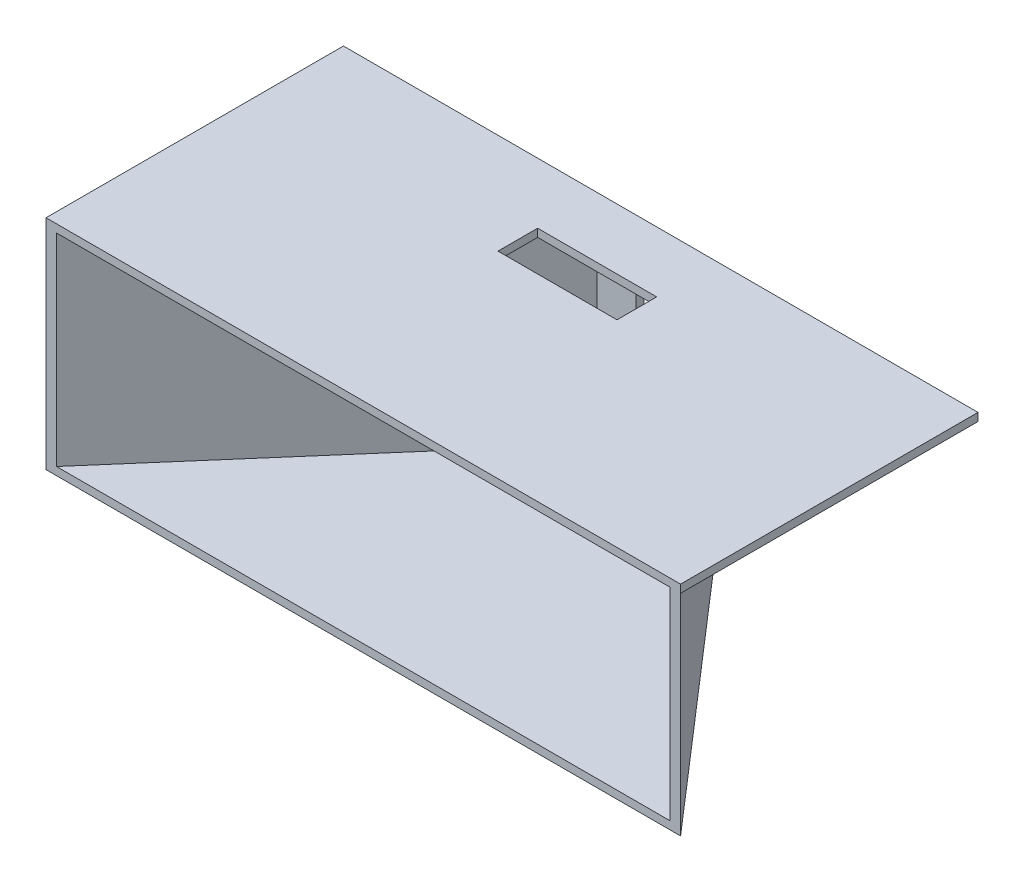
ISO-10303-21;
HEADER;
FILE_DESCRIPTION(('STEP AP214'),'2;1');
FILE_NAME('part.step','',(''),(''),'','','');
FILE_SCHEMA(('AUTOMOTIVE_DESIGN { 1 0 10303 214 1 1 1 1 }'));
ENDSEC;
DATA;
#1=APPLICATION_CONTEXT('core data for automotive mechanical design processes');
#2=APPLICATION_PROTOCOL_DEFINITION('international standard','automotive_design',2000,#1);
#3=PRODUCT_CONTEXT('',#1,'mechanical');
#4=PRODUCT('Part','Part','',(#3));
#5=PRODUCT_RELATED_PRODUCT_CATEGORY('part','',(#4));
#6=PRODUCT_DEFINITION_FORMATION('','',#4);
#7=PRODUCT_DEFINITION_CONTEXT('part definition',#1,'design');
#8=PRODUCT_DEFINITION('design','',#6,#7);
#9=PRODUCT_DEFINITION_SHAPE('','',#8);
#10=(LENGTH_UNIT() NAMED_UNIT(*) SI_UNIT(.MILLI.,.METRE.));
#11=(NAMED_UNIT(*) PLANE_ANGLE_UNIT() SI_UNIT($,.RADIAN.));
#12=(NAMED_UNIT(*) SI_UNIT($,.STERADIAN.) SOLID_ANGLE_UNIT());
#13=UNCERTAINTY_MEASURE_WITH_UNIT(LENGTH_MEASURE(1.E-05),#10,'distance_accuracy_value','');
#14=(GEOMETRIC_REPRESENTATION_CONTEXT(3) GLOBAL_UNCERTAINTY_ASSIGNED_CONTEXT((#13)) GLOBAL_UNIT_ASSIGNED_CONTEXT((#10,
#11,#12)) REPRESENTATION_CONTEXT('',''));
#15=CARTESIAN_POINT('',(0.,0.,0.));
#16=DIRECTION('',(0.,0.,1.));
#17=DIRECTION('',(1.,0.,0.));
#18=AXIS2_PLACEMENT_3D('',#15,#16,#17);
#19=CARTESIAN_POINT('',(0.,-55.,0.));
#20=DIRECTION('',(0.,0.,1.));
#21=DIRECTION('',(1.,0.,0.));
#22=AXIS2_PLACEMENT_3D('',#19,#20,#21);
#23=PLANE('',#22);
#24=DIRECTION('',(0.,1.,0.));
#25=VECTOR('',#24,1.);
#26=CARTESIAN_POINT('',(-157.35335113398,-55.,0.));
#27=LINE('',#26,#25);
#28=CARTESIAN_POINT('',(-157.35335113398,-53.,0.));
#29=VERTEX_POINT('',#28);
#30=CARTESIAN_POINT('',(-157.35335113398,-2.,0.));
#31=VERTEX_POINT('',#30);
#32=EDGE_CURVE('E326',#29,#31,#27,.T.);
#33=ORIENTED_EDGE('',*,*,#32,.T.);
#34=DIRECTION('',(1.,0.,0.));
#35=VECTOR('',#34,1.);
#36=CARTESIAN_POINT('',(0.,-2.,0.));
#37=LINE('',#36,#35);
#38=CARTESIAN_POINT('',(-2.64653333333333,-2.,0.));
#39=VERTEX_POINT('',#38);
#40=EDGE_CURVE('E310',#31,#39,#37,.T.);
#41=ORIENTED_EDGE('',*,*,#40,.T.);
#42=DIRECTION('',(0.,1.,0.));
#43=VECTOR('',#42,1.);
#44=CARTESIAN_POINT('',(-2.64653333333333,-55.,0.));
#45=LINE('',#44,#43);
#46=CARTESIAN_POINT('',(-2.64653333333333,-53.,0.));
#47=VERTEX_POINT('',#46);
#48=EDGE_CURVE('E332',#47,#39,#45,.T.);
#49=ORIENTED_EDGE('',*,*,#48,.F.);
#50=DIRECTION('',(1.,0.,0.));
#51=VECTOR('',#50,1.);
#52=CARTESIAN_POINT('',(0.,-53.,0.));
#53=LINE('',#52,#51);
#54=EDGE_CURVE('E315',#29,#47,#53,.T.);
#55=ORIENTED_EDGE('',*,*,#54,.F.);
#56=EDGE_LOOP('',(#33,#41,#49,#55));
#57=FACE_BOUND('',#56,.T.);
#58=DIRECTION('',(0.,-1.,0.));
#59=VECTOR('',#58,1.);
#60=CARTESIAN_POINT('',(-160.,0.,0.));
#61=LINE('',#60,#59);
#62=CARTESIAN_POINT('',(-160.,0.,0.));
#63=VERTEX_POINT('',#62);
#64=CARTESIAN_POINT('',(-160.,-2.00000000000002,0.));
#65=VERTEX_POINT('',#64);
#66=EDGE_CURVE('E224',#63,#65,#61,.T.);
#67=ORIENTED_EDGE('',*,*,#66,.T.);
#68=DIRECTION('',(0.,1.,0.));
#69=VECTOR('',#68,1.);
#70=CARTESIAN_POINT('',(-160.,-55.,0.));
#71=LINE('',#70,#69);
#72=CARTESIAN_POINT('',(-160.,-55.,0.));
#73=VERTEX_POINT('',#72);
#74=EDGE_CURVE('E48',#73,#65,#71,.T.);
#75=ORIENTED_EDGE('',*,*,#74,.F.);
#76=DIRECTION('',(1.,0.,0.));
#77=VECTOR('',#76,1.);
#78=CARTESIAN_POINT('',(0.,-55.,0.));
#79=LINE('',#78,#77);
#80=CARTESIAN_POINT('',(0.,-55.,0.));
#81=VERTEX_POINT('',#80);
#82=EDGE_CURVE('E357',#73,#81,#79,.T.);
#83=ORIENTED_EDGE('',*,*,#82,.T.);
#84=DIRECTION('',(0.,1.,0.));
#85=VECTOR('',#84,1.);
#86=CARTESIAN_POINT('',(0.,-55.,0.));
#87=LINE('',#86,#85);
#88=CARTESIAN_POINT('',(0.,-2.,0.));
#89=VERTEX_POINT('',#88);
#90=EDGE_CURVE('E11',#81,#89,#87,.T.);
#91=ORIENTED_EDGE('',*,*,#90,.T.);
#92=DIRECTION('',(0.,1.,0.));
#93=VECTOR('',#92,1.);
#94=CARTESIAN_POINT('',(0.,0.,0.));
#95=LINE('',#94,#93);
#96=CARTESIAN_POINT('',(0.,0.,0.));
#97=VERTEX_POINT('',#96);
#98=EDGE_CURVE('E218',#89,#97,#95,.T.);
#99=ORIENTED_EDGE('',*,*,#98,.T.);
#100=DIRECTION('',(1.,0.,0.));
#101=VECTOR('',#100,1.);
#102=CARTESIAN_POINT('',(0.,0.,0.));
#103=LINE('',#102,#101);
#104=EDGE_CURVE('E349',#63,#97,#103,.T.);
#105=ORIENTED_EDGE('',*,*,#104,.F.);
#106=EDGE_LOOP('',(#67,#75,#83,#91,#99,#105));
#107=FACE_BOUND('',#106,.T.);
#108=ADVANCED_FACE('F38',(#57,#107),#23,.T.);
#109=CARTESIAN_POINT('',(-64.9966924158453,-55.,-75.));
#110=DIRECTION('',(0.755705577107159,0.,-0.654911506028972));
#111=DIRECTION('',(-0.654911506028972,0.,-0.755705577107159));
#112=AXIS2_PLACEMENT_3D('',#109,#110,#111);
#113=PLANE('',#112);
#114=DIRECTION('',(-0.654911506028972,0.,-0.755705577107159));
#115=VECTOR('',#114,1.);
#116=CARTESIAN_POINT('',(-64.9966924158453,-2.00000000000001,-75.));
#117=LINE('',#116,#115);
#118=CARTESIAN_POINT('',(-64.9966924158453,-2.00000000000001,-75.));
#119=VERTEX_POINT('',#118);
#120=EDGE_CURVE('E256',#89,#119,#117,.T.);
#121=ORIENTED_EDGE('',*,*,#120,.F.);
#122=ORIENTED_EDGE('',*,*,#90,.F.);
#123=DIRECTION('',(-0.654911506028972,0.,-0.755705577107159));
#124=VECTOR('',#123,1.);
#125=CARTESIAN_POINT('',(-64.9966924158453,-55.,-75.));
#126=LINE('',#125,#124);
#127=CARTESIAN_POINT('',(-64.9966924158453,-55.,-75.));
#128=VERTEX_POINT('',#127);
#129=EDGE_CURVE('E344',#81,#128,#126,.T.);
#130=ORIENTED_EDGE('',*,*,#129,.T.);
#131=DIRECTION('',(0.,1.,0.));
#132=VECTOR('',#131,1.);
#133=CARTESIAN_POINT('',(-64.9966924158453,-55.,-75.));
#134=LINE('',#133,#132);
#135=EDGE_CURVE('E42',#128,#119,#134,.T.);
#136=ORIENTED_EDGE('',*,*,#135,.T.);
#137=EDGE_LOOP('',(#121,#122,#130,#136));
#138=FACE_BOUND('',#137,.T.);
#139=ADVANCED_FACE('F40',(#138),#113,.T.);
#140=CARTESIAN_POINT('',(-160.,-55.,0.));
#141=DIRECTION('',(-0.755672588713195,0.,-0.65494956956051));
#142=DIRECTION('',(-0.65494956956051,0.,0.755672588713195));
#143=AXIS2_PLACEMENT_3D('',#140,#141,#142);
#144=PLANE('',#143);
#145=DIRECTION('',(-0.65494956956051,0.,0.755672588713195));
#146=VECTOR('',#145,1.);
#147=CARTESIAN_POINT('',(-160.,-2.00000000000002,0.));
#148=LINE('',#147,#146);
#149=CARTESIAN_POINT('',(-94.9966924158453,-2.00000000000002,-75.));
#150=VERTEX_POINT('',#149);
#151=EDGE_CURVE('E242',#150,#65,#148,.T.);
#152=ORIENTED_EDGE('',*,*,#151,.F.);
#153=DIRECTION('',(0.,1.,0.));
#154=VECTOR('',#153,1.);
#155=CARTESIAN_POINT('',(-94.9966924158453,-55.,-75.));
#156=LINE('',#155,#154);
#157=CARTESIAN_POINT('',(-94.9966924158453,-55.,-75.));
#158=VERTEX_POINT('',#157);
#159=EDGE_CURVE('E368',#158,#150,#156,.T.);
#160=ORIENTED_EDGE('',*,*,#159,.F.);
#161=DIRECTION('',(-0.65494956956051,0.,0.755672588713195));
#162=VECTOR('',#161,1.);
#163=CARTESIAN_POINT('',(-160.,-55.,0.));
#164=LINE('',#163,#162);
#165=EDGE_CURVE('E353',#158,#73,#164,.T.);
#166=ORIENTED_EDGE('',*,*,#165,.T.);
#167=ORIENTED_EDGE('',*,*,#74,.T.);
#168=EDGE_LOOP('',(#152,#160,#166,#167));
#169=FACE_BOUND('',#168,.T.);
#170=ADVANCED_FACE('F388',(#169),#144,.T.);
#171=CARTESIAN_POINT('',(-94.9966924158453,-55.,-75.));
#172=DIRECTION('',(0.,0.,-1.));
#173=DIRECTION('',(-1.,0.,0.));
#174=AXIS2_PLACEMENT_3D('',#171,#172,#173);
#175=PLANE('',#174);
#176=ORIENTED_EDGE('',*,*,#159,.T.);
#177=DIRECTION('',(1.,0.,0.));
#178=VECTOR('',#177,1.);
#179=CARTESIAN_POINT('',(0.,-2.,-75.));
#180=LINE('',#179,#178);
#181=CARTESIAN_POINT('',(-160.,-2.00000000000002,-75.));
#182=VERTEX_POINT('',#181);
#183=EDGE_CURVE('E229',#182,#150,#180,.T.);
#184=ORIENTED_EDGE('',*,*,#183,.F.);
#185=DIRECTION('',(0.,-1.,0.));
#186=VECTOR('',#185,1.);
#187=CARTESIAN_POINT('',(-160.,0.,-75.));
#188=LINE('',#187,#186);
#189=CARTESIAN_POINT('',(-160.,0.,-75.));
#190=VERTEX_POINT('',#189);
#191=EDGE_CURVE('E223',#190,#182,#188,.T.);
#192=ORIENTED_EDGE('',*,*,#191,.F.);
#193=DIRECTION('',(-1.,0.,0.));
#194=VECTOR('',#193,1.);
#195=CARTESIAN_POINT('',(-94.9966924158453,0.,-75.));
#196=LINE('',#195,#194);
#197=CARTESIAN_POINT('',(0.,0.,-75.));
#198=VERTEX_POINT('',#197);
#199=EDGE_CURVE('E335',#198,#190,#196,.T.);
#200=ORIENTED_EDGE('',*,*,#199,.F.);
#201=DIRECTION('',(0.,1.,0.));
#202=VECTOR('',#201,1.);
#203=CARTESIAN_POINT('',(0.,0.,-75.));
#204=LINE('',#203,#202);
#205=CARTESIAN_POINT('',(0.,-2.,-75.));
#206=VERTEX_POINT('',#205);
#207=EDGE_CURVE('E219',#206,#198,#204,.T.);
#208=ORIENTED_EDGE('',*,*,#207,.F.);
#209=EDGE_CURVE('E228',#119,#206,#180,.T.);
#210=ORIENTED_EDGE('',*,*,#209,.F.);
#211=ORIENTED_EDGE('',*,*,#135,.F.);
#212=DIRECTION('',(-1.,0.,0.));
#213=VECTOR('',#212,1.);
#214=CARTESIAN_POINT('',(-94.9966924158453,-55.,-75.));
#215=LINE('',#214,#213);
#216=EDGE_CURVE('E348',#128,#158,#215,.T.);
#217=ORIENTED_EDGE('',*,*,#216,.T.);
#218=EDGE_LOOP('',(#176,#184,#192,#200,#208,#210,#211,#217));
#219=FACE_BOUND('',#218,.T.);
#220=DIRECTION('',(0.,-1.,0.));
#221=VECTOR('',#220,1.);
#222=CARTESIAN_POINT('',(-75.748465085403,-55.,-75.));
#223=LINE('',#222,#221);
#224=CARTESIAN_POINT('',(-75.748465085403,-12.5,-75.));
#225=VERTEX_POINT('',#224);
#226=CARTESIAN_POINT('',(-75.748465085403,-20.9978019873055,-75.));
#227=VERTEX_POINT('',#226);
#228=EDGE_CURVE('E297',#225,#227,#223,.T.);
#229=ORIENTED_EDGE('',*,*,#228,.F.);
#230=DIRECTION('',(1.,0.,0.));
#231=VECTOR('',#230,1.);
#232=CARTESIAN_POINT('',(-94.9966924158453,-12.5,-75.));
#233=LINE('',#232,#231);
#234=CARTESIAN_POINT('',(-84.248465085403,-12.5,-75.));
#235=VERTEX_POINT('',#234);
#236=EDGE_CURVE('E278',#235,#225,#233,.T.);
#237=ORIENTED_EDGE('',*,*,#236,.F.);
#238=DIRECTION('',(0.,1.,0.));
#239=VECTOR('',#238,1.);
#240=CARTESIAN_POINT('',(-84.248465085403,-55.,-75.));
#241=LINE('',#240,#239);
#242=CARTESIAN_POINT('',(-84.248465085403,-20.9978019873055,-75.));
#243=VERTEX_POINT('',#242);
#244=EDGE_CURVE('E290',#243,#235,#241,.T.);
#245=ORIENTED_EDGE('',*,*,#244,.F.);
#246=DIRECTION('',(-1.,0.,0.));
#247=VECTOR('',#246,1.);
#248=CARTESIAN_POINT('',(-94.9966924158453,-20.9978019873055,-75.));
#249=LINE('',#248,#247);
#250=EDGE_CURVE('E294',#227,#243,#249,.T.);
#251=ORIENTED_EDGE('',*,*,#250,.F.);
#252=EDGE_LOOP('',(#229,#237,#245,#251));
#253=FACE_BOUND('',#252,.T.);
#254=ADVANCED_FACE('F380',(#219,#253),#175,.T.);
#255=CARTESIAN_POINT('',(0.,-55.,0.));
#256=DIRECTION('',(0.,1.,0.));
#257=DIRECTION('',(0.,0.,1.));
#258=AXIS2_PLACEMENT_3D('',#255,#256,#257);
#259=PLANE('',#258);
#260=ORIENTED_EDGE('',*,*,#129,.F.);
#261=ORIENTED_EDGE('',*,*,#82,.F.);
#262=ORIENTED_EDGE('',*,*,#165,.F.);
#263=ORIENTED_EDGE('',*,*,#216,.F.);
#264=EDGE_LOOP('',(#260,#261,#262,#263));
#265=FACE_BOUND('',#264,.T.);
#266=ADVANCED_FACE('F385',(#265),#259,.F.);
#267=CARTESIAN_POINT('',(0.,0.,0.));
#268=DIRECTION('',(0.,1.,0.));
#269=DIRECTION('',(0.,0.,1.));
#270=AXIS2_PLACEMENT_3D('',#267,#268,#269);
#271=PLANE('',#270);
#272=DIRECTION('',(0.,0.,-1.));
#273=VECTOR('',#272,1.);
#274=CARTESIAN_POINT('',(-65.7295292515645,0.,0.));
#275=LINE('',#274,#273);
#276=CARTESIAN_POINT('',(-65.7295292515645,0.,-49.6999557398112));
#277=VERTEX_POINT('',#276);
#278=CARTESIAN_POINT('',(-65.7295292515645,0.,-59.6999557398112));
#279=VERTEX_POINT('',#278);
#280=EDGE_CURVE('E215',#277,#279,#275,.T.);
#281=ORIENTED_EDGE('',*,*,#280,.F.);
#282=DIRECTION('',(1.,0.,0.));
#283=VECTOR('',#282,1.);
#284=CARTESIAN_POINT('',(0.,0.,-49.6999557398112));
#285=LINE('',#284,#283);
#286=CARTESIAN_POINT('',(-95.7295292515645,0.,-49.6999557398112));
#287=VERTEX_POINT('',#286);
#288=EDGE_CURVE('E203',#287,#277,#285,.T.);
#289=ORIENTED_EDGE('',*,*,#288,.F.);
#290=DIRECTION('',(0.,0.,1.));
#291=VECTOR('',#290,1.);
#292=CARTESIAN_POINT('',(-95.7295292515645,0.,0.));
#293=LINE('',#292,#291);
#294=CARTESIAN_POINT('',(-95.7295292515645,0.,-59.6999557398112));
#295=VERTEX_POINT('',#294);
#296=EDGE_CURVE('E178',#295,#287,#293,.T.);
#297=ORIENTED_EDGE('',*,*,#296,.F.);
#298=DIRECTION('',(-1.,0.,0.));
#299=VECTOR('',#298,1.);
#300=CARTESIAN_POINT('',(0.,0.,-59.6999557398112));
#301=LINE('',#300,#299);
#302=EDGE_CURVE('E212',#279,#295,#301,.T.);
#303=ORIENTED_EDGE('',*,*,#302,.F.);
#304=EDGE_LOOP('',(#281,#289,#297,#303));
#305=FACE_BOUND('',#304,.T.);
#306=ORIENTED_EDGE('',*,*,#104,.T.);
#307=DIRECTION('',(0.,0.,1.));
#308=VECTOR('',#307,1.);
#309=CARTESIAN_POINT('',(0.,0.,-75.));
#310=LINE('',#309,#308);
#311=EDGE_CURVE('E233',#198,#97,#310,.T.);
#312=ORIENTED_EDGE('',*,*,#311,.F.);
#313=ORIENTED_EDGE('',*,*,#199,.T.);
#314=DIRECTION('',(0.,0.,1.));
#315=VECTOR('',#314,1.);
#316=CARTESIAN_POINT('',(-160.,0.,-75.));
#317=LINE('',#316,#315);
#318=EDGE_CURVE('E247',#190,#63,#317,.T.);
#319=ORIENTED_EDGE('',*,*,#318,.T.);
#320=EDGE_LOOP('',(#306,#312,#313,#319));
#321=FACE_BOUND('',#320,.T.);
#322=ADVANCED_FACE('F398',(#305,#321),#271,.T.);
#323=CARTESIAN_POINT('',(-66.5081035700596,-55.,-73.690176987942));
#324=DIRECTION('',(0.755705577107159,0.,-0.654911506028972));
#325=DIRECTION('',(-0.654911506028972,0.,-0.755705577107159));
#326=AXIS2_PLACEMENT_3D('',#323,#324,#325);
#327=PLANE('',#326);
#328=DIRECTION('',(-0.654911506028972,0.,-0.755705577107159));
#329=VECTOR('',#328,1.);
#330=CARTESIAN_POINT('',(-1.51141115421431,-2.,1.30982301205794));
#331=LINE('',#330,#329);
#332=CARTESIAN_POINT('',(-65.9099806180894,-2.,-73.));
#333=VERTEX_POINT('',#332);
#334=EDGE_CURVE('E300',#39,#333,#331,.T.);
#335=ORIENTED_EDGE('',*,*,#334,.T.);
#336=DIRECTION('',(0.,1.,0.));
#337=VECTOR('',#336,1.);
#338=CARTESIAN_POINT('',(-65.9099806180894,-55.,-73.));
#339=LINE('',#338,#337);
#340=CARTESIAN_POINT('',(-65.9099806180894,-53.,-73.));
#341=VERTEX_POINT('',#340);
#342=EDGE_CURVE('E311',#341,#333,#339,.T.);
#343=ORIENTED_EDGE('',*,*,#342,.F.);
#344=DIRECTION('',(-0.654911506028972,0.,-0.755705577107159));
#345=VECTOR('',#344,1.);
#346=CARTESIAN_POINT('',(-1.51141115421431,-53.,1.30982301205794));
#347=LINE('',#346,#345);
#348=EDGE_CURVE('E305',#47,#341,#347,.T.);
#349=ORIENTED_EDGE('',*,*,#348,.F.);
#350=ORIENTED_EDGE('',*,*,#48,.T.);
#351=EDGE_LOOP('',(#335,#343,#349,#350));
#352=FACE_BOUND('',#351,.T.);
#353=ADVANCED_FACE('F434',(#352),#327,.F.);
#354=CARTESIAN_POINT('',(-158.488654822574,-55.,1.30989913912104));
#355=DIRECTION('',(-0.755672588713195,0.,-0.65494956956051));
#356=DIRECTION('',(-0.65494956956051,0.,0.755672588713195));
#357=AXIS2_PLACEMENT_3D('',#354,#355,#356);
#358=PLANE('',#357);
#359=DIRECTION('',(-0.65494956956051,0.,0.755672588713195));
#360=VECTOR('',#359,1.);
#361=CARTESIAN_POINT('',(-89.8552246357739,-2.,-77.8784907339004));
#362=LINE('',#361,#360);
#363=CARTESIAN_POINT('',(-94.0834650854029,-2.,-73.));
#364=VERTEX_POINT('',#363);
#365=EDGE_CURVE('E319',#364,#31,#362,.T.);
#366=ORIENTED_EDGE('',*,*,#365,.T.);
#367=ORIENTED_EDGE('',*,*,#32,.F.);
#368=DIRECTION('',(-0.65494956956051,0.,0.755672588713195));
#369=VECTOR('',#368,1.);
#370=CARTESIAN_POINT('',(-89.8552246357739,-53.,-77.8784907339004));
#371=LINE('',#370,#369);
#372=CARTESIAN_POINT('',(-94.0834650854029,-53.,-73.));
#373=VERTEX_POINT('',#372);
#374=EDGE_CURVE('E323',#373,#29,#371,.T.);
#375=ORIENTED_EDGE('',*,*,#374,.F.);
#376=DIRECTION('',(0.,1.,0.));
#377=VECTOR('',#376,1.);
#378=CARTESIAN_POINT('',(-94.083465085403,-55.,-73.));
#379=LINE('',#378,#377);
#380=EDGE_CURVE('E314',#373,#364,#379,.T.);
#381=ORIENTED_EDGE('',*,*,#380,.T.);
#382=EDGE_LOOP('',(#366,#367,#375,#381));
#383=FACE_BOUND('',#382,.T.);
#384=ADVANCED_FACE('F447',(#383),#358,.F.);
#385=CARTESIAN_POINT('',(-94.9966924158453,-55.,-73.));
#386=DIRECTION('',(0.,0.,-1.));
#387=DIRECTION('',(-1.,0.,0.));
#388=AXIS2_PLACEMENT_3D('',#385,#386,#387);
#389=PLANE('',#388);
#390=DIRECTION('',(-1.,0.,0.));
#391=VECTOR('',#390,1.);
#392=CARTESIAN_POINT('',(-75.748465085403,-12.5,-73.));
#393=LINE('',#392,#391);
#394=CARTESIAN_POINT('',(-75.748465085403,-12.5,-73.));
#395=VERTEX_POINT('',#394);
#396=CARTESIAN_POINT('',(-84.248465085403,-12.5,-73.));
#397=VERTEX_POINT('',#396);
#398=EDGE_CURVE('E262',#395,#397,#393,.T.);
#399=ORIENTED_EDGE('',*,*,#398,.F.);
#400=DIRECTION('',(0.,1.,0.));
#401=VECTOR('',#400,1.);
#402=CARTESIAN_POINT('',(-75.748465085403,-20.9978019873055,-73.));
#403=LINE('',#402,#401);
#404=CARTESIAN_POINT('',(-75.748465085403,-20.9978019873055,-73.));
#405=VERTEX_POINT('',#404);
#406=EDGE_CURVE('E259',#405,#395,#403,.T.);
#407=ORIENTED_EDGE('',*,*,#406,.F.);
#408=DIRECTION('',(1.,0.,0.));
#409=VECTOR('',#408,1.);
#410=CARTESIAN_POINT('',(-75.748465085403,-20.9978019873055,-73.));
#411=LINE('',#410,#409);
#412=CARTESIAN_POINT('',(-84.248465085403,-20.9978019873055,-73.));
#413=VERTEX_POINT('',#412);
#414=EDGE_CURVE('E270',#413,#405,#411,.T.);
#415=ORIENTED_EDGE('',*,*,#414,.F.);
#416=DIRECTION('',(0.,-1.,0.));
#417=VECTOR('',#416,1.);
#418=CARTESIAN_POINT('',(-84.248465085403,-20.9978019873055,-73.));
#419=LINE('',#418,#417);
#420=EDGE_CURVE('E266',#397,#413,#419,.T.);
#421=ORIENTED_EDGE('',*,*,#420,.F.);
#422=EDGE_LOOP('',(#399,#407,#415,#421));
#423=FACE_BOUND('',#422,.T.);
#424=DIRECTION('',(-1.,0.,0.));
#425=VECTOR('',#424,1.);
#426=CARTESIAN_POINT('',(0.,-2.,-73.));
#427=LINE('',#426,#425);
#428=EDGE_CURVE('E304',#333,#364,#427,.T.);
#429=ORIENTED_EDGE('',*,*,#428,.T.);
#430=ORIENTED_EDGE('',*,*,#380,.F.);
#431=DIRECTION('',(-1.,0.,0.));
#432=VECTOR('',#431,1.);
#433=CARTESIAN_POINT('',(0.,-53.,-73.));
#434=LINE('',#433,#432);
#435=EDGE_CURVE('E309',#341,#373,#434,.T.);
#436=ORIENTED_EDGE('',*,*,#435,.F.);
#437=ORIENTED_EDGE('',*,*,#342,.T.);
#438=EDGE_LOOP('',(#429,#430,#436,#437));
#439=FACE_BOUND('',#438,.T.);
#440=ADVANCED_FACE('F443',(#423,#439),#389,.F.);
#441=CARTESIAN_POINT('',(0.,-53.,0.));
#442=DIRECTION('',(0.,1.,0.));
#443=DIRECTION('',(0.,0.,1.));
#444=AXIS2_PLACEMENT_3D('',#441,#442,#443);
#445=PLANE('',#444);
#446=ORIENTED_EDGE('',*,*,#348,.T.);
#447=ORIENTED_EDGE('',*,*,#435,.T.);
#448=ORIENTED_EDGE('',*,*,#374,.T.);
#449=ORIENTED_EDGE('',*,*,#54,.T.);
#450=EDGE_LOOP('',(#446,#447,#448,#449));
#451=FACE_BOUND('',#450,.T.);
#452=ADVANCED_FACE('F440',(#451),#445,.T.);
#453=CARTESIAN_POINT('',(0.,-2.,0.));
#454=DIRECTION('',(0.,1.,0.));
#455=DIRECTION('',(0.,0.,1.));
#456=AXIS2_PLACEMENT_3D('',#453,#454,#455);
#457=PLANE('',#456);
#458=DIRECTION('',(-1.,0.,0.));
#459=VECTOR('',#458,1.);
#460=CARTESIAN_POINT('',(-65.7295292515645,-2.,-49.6999557398112));
#461=LINE('',#460,#459);
#462=CARTESIAN_POINT('',(-65.7295292515645,-2.,-49.6999557398112));
#463=VERTEX_POINT('',#462);
#464=CARTESIAN_POINT('',(-95.7295292515645,-2.,-49.6999557398112));
#465=VERTEX_POINT('',#464);
#466=EDGE_CURVE('E185',#463,#465,#461,.T.);
#467=ORIENTED_EDGE('',*,*,#466,.F.);
#468=DIRECTION('',(0.,0.,1.));
#469=VECTOR('',#468,1.);
#470=CARTESIAN_POINT('',(-65.7295292515645,-2.,-59.6999557398112));
#471=LINE('',#470,#469);
#472=CARTESIAN_POINT('',(-65.7295292515645,-2.,-59.6999557398112));
#473=VERTEX_POINT('',#472);
#474=EDGE_CURVE('E64',#473,#463,#471,.T.);
#475=ORIENTED_EDGE('',*,*,#474,.F.);
#476=DIRECTION('',(1.,0.,0.));
#477=VECTOR('',#476,1.);
#478=CARTESIAN_POINT('',(-65.7295292515645,-2.,-59.6999557398112));
#479=LINE('',#478,#477);
#480=CARTESIAN_POINT('',(-95.7295292515645,-2.,-59.6999557398112));
#481=VERTEX_POINT('',#480);
#482=EDGE_CURVE('E193',#481,#473,#479,.T.);
#483=ORIENTED_EDGE('',*,*,#482,.F.);
#484=DIRECTION('',(0.,0.,-1.));
#485=VECTOR('',#484,1.);
#486=CARTESIAN_POINT('',(-95.7295292515645,-2.,-59.6999557398112));
#487=LINE('',#486,#485);
#488=EDGE_CURVE('E175',#465,#481,#487,.T.);
#489=ORIENTED_EDGE('',*,*,#488,.F.);
#490=EDGE_LOOP('',(#467,#475,#483,#489));
#491=FACE_BOUND('',#490,.T.);
#492=ORIENTED_EDGE('',*,*,#334,.F.);
#493=ORIENTED_EDGE('',*,*,#40,.F.);
#494=ORIENTED_EDGE('',*,*,#365,.F.);
#495=ORIENTED_EDGE('',*,*,#428,.F.);
#496=EDGE_LOOP('',(#492,#493,#494,#495));
#497=FACE_BOUND('',#496,.T.);
#498=ADVANCED_FACE('F190',(#491,#497),#457,.F.);
#499=CARTESIAN_POINT('',(-75.748465085403,-20.9978019873055,-79.));
#500=DIRECTION('',(1.,0.,0.));
#501=DIRECTION('',(0.,0.,-1.));
#502=AXIS2_PLACEMENT_3D('',#499,#500,#501);
#503=PLANE('',#502);
#504=ORIENTED_EDGE('',*,*,#228,.T.);
#505=DIRECTION('',(0.,0.,1.));
#506=VECTOR('',#505,1.);
#507=CARTESIAN_POINT('',(-75.748465085403,-20.9978019873055,-79.));
#508=LINE('',#507,#506);
#509=EDGE_CURVE('E275',#227,#405,#508,.T.);
#510=ORIENTED_EDGE('',*,*,#509,.T.);
#511=ORIENTED_EDGE('',*,*,#406,.T.);
#512=DIRECTION('',(0.,0.,1.));
#513=VECTOR('',#512,1.);
#514=CARTESIAN_POINT('',(-75.748465085403,-12.5,-79.));
#515=LINE('',#514,#513);
#516=EDGE_CURVE('E274',#225,#395,#515,.T.);
#517=ORIENTED_EDGE('',*,*,#516,.F.);
#518=EDGE_LOOP('',(#504,#510,#511,#517));
#519=FACE_BOUND('',#518,.T.);
#520=ADVANCED_FACE('F439',(#519),#503,.F.);
#521=CARTESIAN_POINT('',(-75.748465085403,-20.9978019873055,-79.));
#522=DIRECTION('',(0.,-1.,0.));
#523=DIRECTION('',(0.,0.,-1.));
#524=AXIS2_PLACEMENT_3D('',#521,#522,#523);
#525=PLANE('',#524);
#526=ORIENTED_EDGE('',*,*,#250,.T.);
#527=DIRECTION('',(0.,0.,1.));
#528=VECTOR('',#527,1.);
#529=CARTESIAN_POINT('',(-84.248465085403,-20.9978019873055,-79.));
#530=LINE('',#529,#528);
#531=EDGE_CURVE('E279',#243,#413,#530,.T.);
#532=ORIENTED_EDGE('',*,*,#531,.T.);
#533=ORIENTED_EDGE('',*,*,#414,.T.);
#534=ORIENTED_EDGE('',*,*,#509,.F.);
#535=EDGE_LOOP('',(#526,#532,#533,#534));
#536=FACE_BOUND('',#535,.T.);
#537=ADVANCED_FACE('F457',(#536),#525,.F.);
#538=CARTESIAN_POINT('',(-84.248465085403,-20.9978019873055,-79.));
#539=DIRECTION('',(-1.,0.,0.));
#540=DIRECTION('',(0.,0.,1.));
#541=AXIS2_PLACEMENT_3D('',#538,#539,#540);
#542=PLANE('',#541);
#543=ORIENTED_EDGE('',*,*,#244,.T.);
#544=DIRECTION('',(0.,0.,1.));
#545=VECTOR('',#544,1.);
#546=CARTESIAN_POINT('',(-84.248465085403,-12.5,-79.));
#547=LINE('',#546,#545);
#548=EDGE_CURVE('E282',#235,#397,#547,.T.);
#549=ORIENTED_EDGE('',*,*,#548,.T.);
#550=ORIENTED_EDGE('',*,*,#420,.T.);
#551=ORIENTED_EDGE('',*,*,#531,.F.);
#552=EDGE_LOOP('',(#543,#549,#550,#551));
#553=FACE_BOUND('',#552,.T.);
#554=ADVANCED_FACE('F462',(#553),#542,.F.);
#555=CARTESIAN_POINT('',(-75.748465085403,-12.5,-79.));
#556=DIRECTION('',(0.,1.,0.));
#557=DIRECTION('',(-1.,0.,0.));
#558=AXIS2_PLACEMENT_3D('',#555,#556,#557);
#559=PLANE('',#558);
#560=ORIENTED_EDGE('',*,*,#236,.T.);
#561=ORIENTED_EDGE('',*,*,#516,.T.);
#562=ORIENTED_EDGE('',*,*,#398,.T.);
#563=ORIENTED_EDGE('',*,*,#548,.F.);
#564=EDGE_LOOP('',(#560,#561,#562,#563));
#565=FACE_BOUND('',#564,.T.);
#566=ADVANCED_FACE('F459',(#565),#559,.F.);
#567=CARTESIAN_POINT('',(-160.,0.,-75.));
#568=DIRECTION('',(-1.,0.,0.));
#569=DIRECTION('',(0.,0.,1.));
#570=AXIS2_PLACEMENT_3D('',#567,#568,#569);
#571=PLANE('',#570);
#572=ORIENTED_EDGE('',*,*,#66,.F.);
#573=ORIENTED_EDGE('',*,*,#318,.F.);
#574=ORIENTED_EDGE('',*,*,#191,.T.);
#575=DIRECTION('',(0.,0.,1.));
#576=VECTOR('',#575,1.);
#577=CARTESIAN_POINT('',(-160.,-2.00000000000002,-75.));
#578=LINE('',#577,#576);
#579=EDGE_CURVE('E243',#182,#65,#578,.T.);
#580=ORIENTED_EDGE('',*,*,#579,.T.);
#581=EDGE_LOOP('',(#572,#573,#574,#580));
#582=FACE_BOUND('',#581,.T.);
#583=ADVANCED_FACE('F393',(#582),#571,.T.);
#584=CARTESIAN_POINT('',(0.,-2.,-75.));
#585=DIRECTION('',(0.,-1.,0.));
#586=DIRECTION('',(1.,0.,0.));
#587=AXIS2_PLACEMENT_3D('',#584,#585,#586);
#588=PLANE('',#587);
#589=ORIENTED_EDGE('',*,*,#183,.T.);
#590=ORIENTED_EDGE('',*,*,#151,.T.);
#591=ORIENTED_EDGE('',*,*,#579,.F.);
#592=EDGE_LOOP('',(#589,#590,#591));
#593=FACE_BOUND('',#592,.T.);
#594=ADVANCED_FACE('F390',(#593),#588,.T.);
#595=DIRECTION('',(0.,0.,1.));
#596=VECTOR('',#595,1.);
#597=CARTESIAN_POINT('',(0.,-2.,-75.));
#598=LINE('',#597,#596);
#599=EDGE_CURVE('E239',#206,#89,#598,.T.);
#600=ORIENTED_EDGE('',*,*,#599,.T.);
#601=ORIENTED_EDGE('',*,*,#120,.T.);
#602=ORIENTED_EDGE('',*,*,#209,.T.);
#603=EDGE_LOOP('',(#600,#601,#602));
#604=FACE_BOUND('',#603,.T.);
#605=ADVANCED_FACE('F404',(#604),#588,.T.);
#606=CARTESIAN_POINT('',(0.,0.,-75.));
#607=DIRECTION('',(1.,0.,0.));
#608=DIRECTION('',(0.,1.,0.));
#609=AXIS2_PLACEMENT_3D('',#606,#607,#608);
#610=PLANE('',#609);
#611=ORIENTED_EDGE('',*,*,#98,.F.);
#612=ORIENTED_EDGE('',*,*,#599,.F.);
#613=ORIENTED_EDGE('',*,*,#207,.T.);
#614=ORIENTED_EDGE('',*,*,#311,.T.);
#615=EDGE_LOOP('',(#611,#612,#613,#614));
#616=FACE_BOUND('',#615,.T.);
#617=ADVANCED_FACE('F402',(#616),#610,.T.);
#618=CARTESIAN_POINT('',(-65.7295292515645,6.,-59.6999557398112));
#619=DIRECTION('',(1.,0.,0.));
#620=DIRECTION('',(0.,0.,-1.));
#621=AXIS2_PLACEMENT_3D('',#618,#619,#620);
#622=PLANE('',#621);
#623=ORIENTED_EDGE('',*,*,#280,.T.);
#624=DIRECTION('',(0.,-1.,0.));
#625=VECTOR('',#624,1.);
#626=CARTESIAN_POINT('',(-65.7295292515645,6.,-59.6999557398112));
#627=LINE('',#626,#625);
#628=EDGE_CURVE('E200',#279,#473,#627,.T.);
#629=ORIENTED_EDGE('',*,*,#628,.T.);
#630=ORIENTED_EDGE('',*,*,#474,.T.);
#631=DIRECTION('',(0.,-1.,0.));
#632=VECTOR('',#631,1.);
#633=CARTESIAN_POINT('',(-65.7295292515645,6.,-49.6999557398112));
#634=LINE('',#633,#632);
#635=EDGE_CURVE('E182',#277,#463,#634,.T.);
#636=ORIENTED_EDGE('',*,*,#635,.F.);
#637=EDGE_LOOP('',(#623,#629,#630,#636));
#638=FACE_BOUND('',#637,.T.);
#639=ADVANCED_FACE('F412',(#638),#622,.F.);
#640=CARTESIAN_POINT('',(-65.7295292515645,6.,-59.6999557398112));
#641=DIRECTION('',(0.,0.,-1.));
#642=DIRECTION('',(-1.,0.,0.));
#643=AXIS2_PLACEMENT_3D('',#640,#641,#642);
#644=PLANE('',#643);
#645=ORIENTED_EDGE('',*,*,#302,.T.);
#646=DIRECTION('',(0.,-1.,0.));
#647=VECTOR('',#646,1.);
#648=CARTESIAN_POINT('',(-95.7295292515645,6.,-59.6999557398112));
#649=LINE('',#648,#647);
#650=EDGE_CURVE('E181',#295,#481,#649,.T.);
#651=ORIENTED_EDGE('',*,*,#650,.T.);
#652=ORIENTED_EDGE('',*,*,#482,.T.);
#653=ORIENTED_EDGE('',*,*,#628,.F.);
#654=EDGE_LOOP('',(#645,#651,#652,#653));
#655=FACE_BOUND('',#654,.T.);
#656=ADVANCED_FACE('F512',(#655),#644,.F.);
#657=CARTESIAN_POINT('',(-95.7295292515645,6.,-59.6999557398112));
#658=DIRECTION('',(-1.,0.,0.));
#659=DIRECTION('',(0.,0.,1.));
#660=AXIS2_PLACEMENT_3D('',#657,#658,#659);
#661=PLANE('',#660);
#662=ORIENTED_EDGE('',*,*,#296,.T.);
#663=DIRECTION('',(0.,-1.,0.));
#664=VECTOR('',#663,1.);
#665=CARTESIAN_POINT('',(-95.7295292515645,6.,-49.6999557398112));
#666=LINE('',#665,#664);
#667=EDGE_CURVE('E56',#287,#465,#666,.T.);
#668=ORIENTED_EDGE('',*,*,#667,.T.);
#669=ORIENTED_EDGE('',*,*,#488,.T.);
#670=ORIENTED_EDGE('',*,*,#650,.F.);
#671=EDGE_LOOP('',(#662,#668,#669,#670));
#672=FACE_BOUND('',#671,.T.);
#673=ADVANCED_FACE('F172',(#672),#661,.F.);
#674=CARTESIAN_POINT('',(-65.7295292515645,6.,-49.6999557398112));
#675=DIRECTION('',(0.,0.,1.));
#676=DIRECTION('',(1.,0.,0.));
#677=AXIS2_PLACEMENT_3D('',#674,#675,#676);
#678=PLANE('',#677);
#679=ORIENTED_EDGE('',*,*,#288,.T.);
#680=ORIENTED_EDGE('',*,*,#635,.T.);
#681=ORIENTED_EDGE('',*,*,#466,.T.);
#682=ORIENTED_EDGE('',*,*,#667,.F.);
#683=EDGE_LOOP('',(#679,#680,#681,#682));
#684=FACE_BOUND('',#683,.T.);
#685=ADVANCED_FACE('F186',(#684),#678,.F.);
#686=CLOSED_SHELL('',(#108,#139,#170,#254,#266,#322,#353,#384,#440,#452,#498,#520,#537,#554,
#566,#583,#594,#605,#617,#639,#656,#673,#685));
#687=MANIFOLD_SOLID_BREP('B2',#686);
#688=ADVANCED_BREP_SHAPE_REPRESENTATION('',(#18,#687),#14);
#689=SHAPE_DEFINITION_REPRESENTATION(#9,#688);
ENDSEC;
END-ISO-10303-21;
